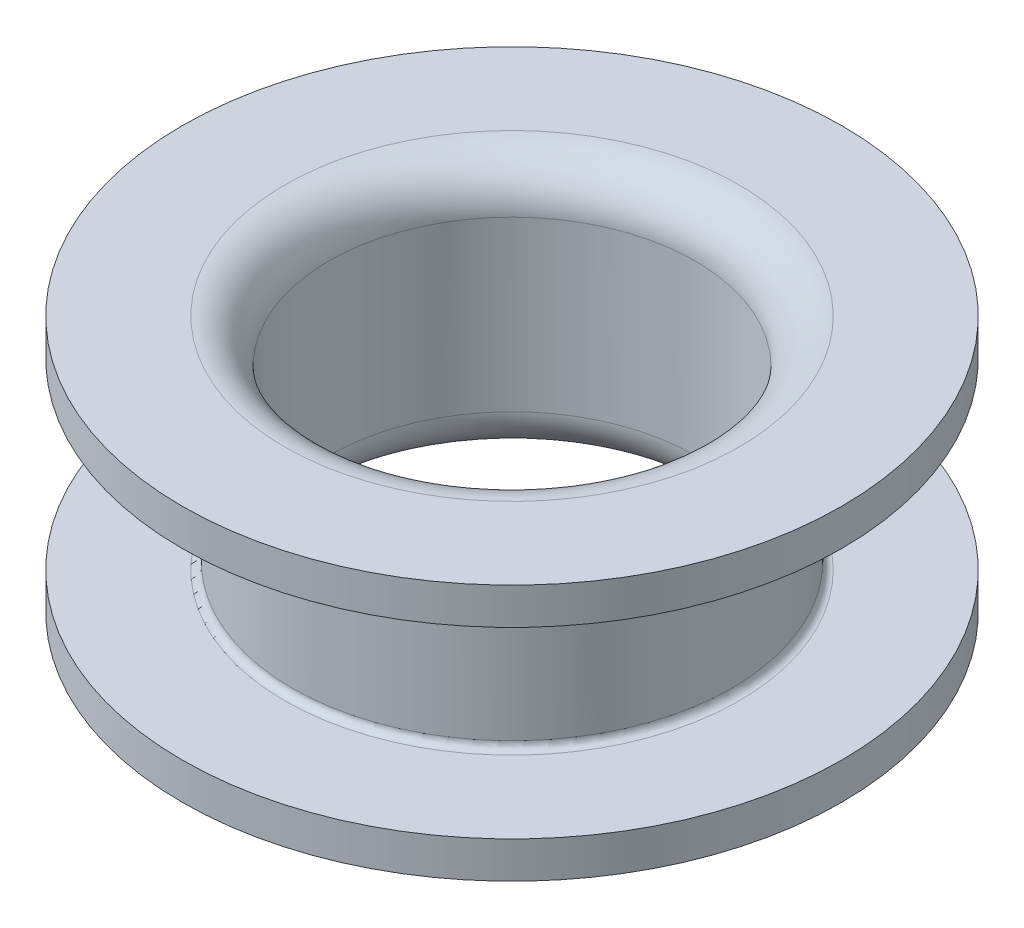
ISO-10303-21;
HEADER;
FILE_DESCRIPTION(('STEP AP214'),'2;1');
FILE_NAME('part.step','',(''),(''),'','','');
FILE_SCHEMA(('AUTOMOTIVE_DESIGN { 1 0 10303 214 1 1 1 1 }'));
ENDSEC;
DATA;
#1=APPLICATION_CONTEXT('core data for automotive mechanical design processes');
#2=APPLICATION_PROTOCOL_DEFINITION('international standard','automotive_design',2000,#1);
#3=PRODUCT_CONTEXT('',#1,'mechanical');
#4=PRODUCT('Part','Part','',(#3));
#5=PRODUCT_RELATED_PRODUCT_CATEGORY('part','',(#4));
#6=PRODUCT_DEFINITION_FORMATION('','',#4);
#7=PRODUCT_DEFINITION_CONTEXT('part definition',#1,'design');
#8=PRODUCT_DEFINITION('design','',#6,#7);
#9=PRODUCT_DEFINITION_SHAPE('','',#8);
#10=(LENGTH_UNIT() NAMED_UNIT(*) SI_UNIT(.MILLI.,.METRE.));
#11=(NAMED_UNIT(*) PLANE_ANGLE_UNIT() SI_UNIT($,.RADIAN.));
#12=(NAMED_UNIT(*) SI_UNIT($,.STERADIAN.) SOLID_ANGLE_UNIT());
#13=UNCERTAINTY_MEASURE_WITH_UNIT(LENGTH_MEASURE(1.E-05),#10,'distance_accuracy_value','');
#14=(GEOMETRIC_REPRESENTATION_CONTEXT(3) GLOBAL_UNCERTAINTY_ASSIGNED_CONTEXT((#13)) GLOBAL_UNIT_ASSIGNED_CONTEXT((#10,
#11,#12)) REPRESENTATION_CONTEXT('',''));
#15=CARTESIAN_POINT('',(0.,0.,0.));
#16=DIRECTION('',(0.,0.,1.));
#17=DIRECTION('',(1.,0.,0.));
#18=AXIS2_PLACEMENT_3D('',#15,#16,#17);
#19=CARTESIAN_POINT('',(2160.44964706,605.52533354,716.131939028996));
#20=DIRECTION('',(0.,-1.,0.));
#21=DIRECTION('',(0.,0.,-1.));
#22=AXIS2_PLACEMENT_3D('',#19,#20,#21);
#23=CYLINDRICAL_SURFACE('',#22,8.9999999999999);
#24=CARTESIAN_POINT('',(2160.44964706,605.52533354,716.131939028996));
#25=DIRECTION('',(0.,-1.,0.));
#26=DIRECTION('',(0.,0.,-1.));
#27=AXIS2_PLACEMENT_3D('',#24,#25,#26);
#28=CIRCLE('',#27,8.9999999999999);
#29=CARTESIAN_POINT('',(2160.44964706,605.52533354,707.131939028996));
#30=VERTEX_POINT('',#29);
#31=EDGE_CURVE('E64',#30,#30,#28,.T.);
#32=ORIENTED_EDGE('',*,*,#31,.T.);
#33=EDGE_LOOP('',(#32));
#34=FACE_BOUND('',#33,.T.);
#35=CARTESIAN_POINT('',(2160.44964706,604.52533354,716.131939028996));
#36=DIRECTION('',(0.,-1.,0.));
#37=DIRECTION('',(0.,0.,-1.));
#38=AXIS2_PLACEMENT_3D('',#35,#36,#37);
#39=CIRCLE('',#38,8.9999999999999);
#40=CARTESIAN_POINT('',(2160.44964706,604.52533354,707.131939028996));
#41=VERTEX_POINT('',#40);
#42=EDGE_CURVE('E73',#41,#41,#39,.T.);
#43=ORIENTED_EDGE('',*,*,#42,.F.);
#44=EDGE_LOOP('',(#43));
#45=FACE_BOUND('',#44,.T.);
#46=ADVANCED_FACE('F33',(#34,#45),#23,.T.);
#47=CARTESIAN_POINT('',(2169.44964706,605.52533354,716.131939028996));
#48=DIRECTION('',(0.,1.,0.));
#49=DIRECTION('',(0.,0.,1.));
#50=AXIS2_PLACEMENT_3D('',#47,#48,#49);
#51=PLANE('',#50);
#52=CARTESIAN_POINT('',(2160.44964706,605.52533354,716.131939028996));
#53=DIRECTION('',(0.,1.,0.));
#54=DIRECTION('',(0.,0.,1.));
#55=AXIS2_PLACEMENT_3D('',#52,#53,#54);
#56=CIRCLE('',#55,6.19999999999989);
#57=CARTESIAN_POINT('',(2160.44964706,605.52533354,722.331939028996));
#58=VERTEX_POINT('',#57);
#59=EDGE_CURVE('E10',#58,#58,#56,.F.);
#60=ORIENTED_EDGE('',*,*,#59,.T.);
#61=EDGE_LOOP('',(#60));
#62=FACE_BOUND('',#61,.T.);
#63=ORIENTED_EDGE('',*,*,#31,.F.);
#64=EDGE_LOOP('',(#63));
#65=FACE_BOUND('',#64,.T.);
#66=ADVANCED_FACE('F80',(#62,#65),#51,.T.);
#67=CARTESIAN_POINT('',(2160.44964706,598.52533354,716.131939028996));
#68=DIRECTION('',(0.,-1.,0.));
#69=DIRECTION('',(0.,0.,-1.));
#70=AXIS2_PLACEMENT_3D('',#67,#68,#69);
#71=PLANE('',#70);
#72=CARTESIAN_POINT('',(2160.44964706,598.52533354,716.131939028996));
#73=DIRECTION('',(0.,-1.,0.));
#74=DIRECTION('',(0.,0.,-1.));
#75=AXIS2_PLACEMENT_3D('',#72,#73,#74);
#76=CIRCLE('',#75,6.19999999999989);
#77=CARTESIAN_POINT('',(2160.44964706,598.52533354,709.931939028996));
#78=VERTEX_POINT('',#77);
#79=EDGE_CURVE('E47',#78,#78,#76,.F.);
#80=ORIENTED_EDGE('',*,*,#79,.T.);
#81=EDGE_LOOP('',(#80));
#82=FACE_BOUND('',#81,.T.);
#83=CARTESIAN_POINT('',(2160.44964706,598.52533354,716.131939028996));
#84=DIRECTION('',(0.,-1.,0.));
#85=DIRECTION('',(0.,0.,-1.));
#86=AXIS2_PLACEMENT_3D('',#83,#84,#85);
#87=CIRCLE('',#86,8.9999999999999);
#88=CARTESIAN_POINT('',(2160.44964706,598.52533354,707.131939028996));
#89=VERTEX_POINT('',#88);
#90=EDGE_CURVE('E67',#89,#89,#87,.T.);
#91=ORIENTED_EDGE('',*,*,#90,.T.);
#92=EDGE_LOOP('',(#91));
#93=FACE_BOUND('',#92,.T.);
#94=ADVANCED_FACE('F85',(#82,#93),#71,.T.);
#95=CARTESIAN_POINT('',(2160.44964706,605.52533354,716.131939028996));
#96=DIRECTION('',(0.,-1.,0.));
#97=DIRECTION('',(0.,0.,-1.));
#98=AXIS2_PLACEMENT_3D('',#95,#96,#97);
#99=CYLINDRICAL_SURFACE('',#98,8.9999999999999);
#100=CARTESIAN_POINT('',(2160.44964706,599.525333539999,716.131939028996));
#101=DIRECTION('',(0.,-1.,0.));
#102=DIRECTION('',(0.,0.,-1.));
#103=AXIS2_PLACEMENT_3D('',#100,#101,#102);
#104=CIRCLE('',#103,8.9999999999999);
#105=CARTESIAN_POINT('',(2160.44964706,599.525333539999,707.131939028996));
#106=VERTEX_POINT('',#105);
#107=EDGE_CURVE('E70',#106,#106,#104,.T.);
#108=ORIENTED_EDGE('',*,*,#107,.T.);
#109=EDGE_LOOP('',(#108));
#110=FACE_BOUND('',#109,.T.);
#111=ORIENTED_EDGE('',*,*,#90,.F.);
#112=EDGE_LOOP('',(#111));
#113=FACE_BOUND('',#112,.T.);
#114=ADVANCED_FACE('F91',(#110,#113),#99,.T.);
#115=CARTESIAN_POINT('',(2169.44964706,599.525333539999,716.131939028996));
#116=DIRECTION('',(0.,1.,0.));
#117=DIRECTION('',(0.,0.,1.));
#118=AXIS2_PLACEMENT_3D('',#115,#116,#117);
#119=PLANE('',#118);
#120=CARTESIAN_POINT('',(2160.44964706,599.525333539999,716.131939028996));
#121=DIRECTION('',(0.,1.,0.));
#122=DIRECTION('',(0.,0.,1.));
#123=AXIS2_PLACEMENT_3D('',#120,#121,#122);
#124=CIRCLE('',#123,6.19999999999978);
#125=CARTESIAN_POINT('',(2160.44964706,599.525333539999,722.331939028996));
#126=VERTEX_POINT('',#125);
#127=EDGE_CURVE('E61',#126,#126,#124,.F.);
#128=ORIENTED_EDGE('',*,*,#127,.T.);
#129=EDGE_LOOP('',(#128));
#130=FACE_BOUND('',#129,.T.);
#131=ORIENTED_EDGE('',*,*,#107,.F.);
#132=EDGE_LOOP('',(#131));
#133=FACE_BOUND('',#132,.T.);
#134=ADVANCED_FACE('F97',(#130,#133),#119,.T.);
#135=CARTESIAN_POINT('',(2160.44964706,605.52533354,716.131939028996));
#136=DIRECTION('',(0.,-1.,0.));
#137=DIRECTION('',(0.,0.,-1.));
#138=AXIS2_PLACEMENT_3D('',#135,#136,#137);
#139=CYLINDRICAL_SURFACE('',#138,5.99999999999978);
#140=CARTESIAN_POINT('',(2160.44964706,599.725333539999,716.131939028996));
#141=DIRECTION('',(0.,1.,0.));
#142=DIRECTION('',(0.,0.,1.));
#143=AXIS2_PLACEMENT_3D('',#140,#141,#142);
#144=CIRCLE('',#143,5.99999999999978);
#145=CARTESIAN_POINT('',(2160.44964706,599.725333539999,722.131939028996));
#146=VERTEX_POINT('',#145);
#147=EDGE_CURVE('E55',#146,#146,#144,.T.);
#148=ORIENTED_EDGE('',*,*,#147,.T.);
#149=EDGE_LOOP('',(#148));
#150=FACE_BOUND('',#149,.T.);
#151=CARTESIAN_POINT('',(2160.44964706,604.32533354,716.131939028996));
#152=DIRECTION('',(0.,-1.,0.));
#153=DIRECTION('',(0.,0.,-1.));
#154=AXIS2_PLACEMENT_3D('',#151,#152,#153);
#155=CIRCLE('',#154,5.99999999999978);
#156=CARTESIAN_POINT('',(2160.44964706,604.32533354,710.131939028997));
#157=VERTEX_POINT('',#156);
#158=EDGE_CURVE('E58',#157,#157,#155,.T.);
#159=ORIENTED_EDGE('',*,*,#158,.T.);
#160=EDGE_LOOP('',(#159));
#161=FACE_BOUND('',#160,.T.);
#162=ADVANCED_FACE('F101',(#150,#161),#139,.T.);
#163=CARTESIAN_POINT('',(2166.44964706,604.52533354,716.131939028996));
#164=DIRECTION('',(0.,-1.,0.));
#165=DIRECTION('',(0.,0.,-1.));
#166=AXIS2_PLACEMENT_3D('',#163,#164,#165);
#167=PLANE('',#166);
#168=CARTESIAN_POINT('',(2160.44964706,604.52533354,716.131939028996));
#169=DIRECTION('',(0.,-1.,0.));
#170=DIRECTION('',(0.,0.,-1.));
#171=AXIS2_PLACEMENT_3D('',#168,#169,#170);
#172=CIRCLE('',#171,6.19999999999978);
#173=CARTESIAN_POINT('',(2160.44964706,604.52533354,709.931939028997));
#174=VERTEX_POINT('',#173);
#175=EDGE_CURVE('E52',#174,#174,#172,.F.);
#176=ORIENTED_EDGE('',*,*,#175,.T.);
#177=EDGE_LOOP('',(#176));
#178=FACE_BOUND('',#177,.T.);
#179=ORIENTED_EDGE('',*,*,#42,.T.);
#180=EDGE_LOOP('',(#179));
#181=FACE_BOUND('',#180,.T.);
#182=ADVANCED_FACE('F77',(#178,#181),#167,.T.);
#183=CARTESIAN_POINT('',(2160.44964706,598.525332764001,716.131939028996));
#184=DIRECTION('',(0.,1.,0.));
#185=DIRECTION('',(0.,0.,1.));
#186=AXIS2_PLACEMENT_3D('',#183,#184,#185);
#187=CYLINDRICAL_SURFACE('',#186,4.99999999999989);
#188=CARTESIAN_POINT('',(2160.44964706,599.72533354,716.131939028996));
#189=DIRECTION('',(0.,-1.,0.));
#190=DIRECTION('',(0.,0.,-1.));
#191=AXIS2_PLACEMENT_3D('',#188,#189,#190);
#192=CIRCLE('',#191,4.99999999999989);
#193=CARTESIAN_POINT('',(2160.44964706,599.72533354,711.131939028996));
#194=VERTEX_POINT('',#193);
#195=EDGE_CURVE('E39',#194,#194,#192,.T.);
#196=ORIENTED_EDGE('',*,*,#195,.T.);
#197=EDGE_LOOP('',(#196));
#198=FACE_BOUND('',#197,.T.);
#199=CARTESIAN_POINT('',(2160.44964706,604.32533354,716.131939028996));
#200=DIRECTION('',(0.,1.,0.));
#201=DIRECTION('',(0.,0.,1.));
#202=AXIS2_PLACEMENT_3D('',#199,#200,#201);
#203=CIRCLE('',#202,4.99999999999989);
#204=CARTESIAN_POINT('',(2160.44964706,604.32533354,721.131939028996));
#205=VERTEX_POINT('',#204);
#206=EDGE_CURVE('E43',#205,#205,#203,.T.);
#207=ORIENTED_EDGE('',*,*,#206,.T.);
#208=EDGE_LOOP('',(#207));
#209=FACE_BOUND('',#208,.T.);
#210=ADVANCED_FACE('F108',(#198,#209),#187,.F.);
#211=CARTESIAN_POINT('',(2160.44964706,599.725333539999,716.131939028996));
#212=DIRECTION('',(0.,1.,0.));
#213=DIRECTION('',(0.,0.,1.));
#214=AXIS2_PLACEMENT_3D('',#211,#212,#213);
#215=TOROIDAL_SURFACE('',#214,6.19999999999978,0.2);
#216=ORIENTED_EDGE('',*,*,#147,.F.);
#217=EDGE_LOOP('',(#216));
#218=FACE_BOUND('',#217,.T.);
#219=ORIENTED_EDGE('',*,*,#127,.F.);
#220=EDGE_LOOP('',(#219));
#221=FACE_BOUND('',#220,.T.);
#222=ADVANCED_FACE('F112',(#218,#221),#215,.F.);
#223=CARTESIAN_POINT('',(2160.44964706,604.32533354,716.131939028996));
#224=DIRECTION('',(0.,-1.,0.));
#225=DIRECTION('',(0.,0.,-1.));
#226=AXIS2_PLACEMENT_3D('',#223,#224,#225);
#227=TOROIDAL_SURFACE('',#226,6.19999999999978,0.2);
#228=ORIENTED_EDGE('',*,*,#175,.F.);
#229=EDGE_LOOP('',(#228));
#230=FACE_BOUND('',#229,.T.);
#231=ORIENTED_EDGE('',*,*,#158,.F.);
#232=EDGE_LOOP('',(#231));
#233=FACE_BOUND('',#232,.T.);
#234=ADVANCED_FACE('F115',(#230,#233),#227,.F.);
#235=CARTESIAN_POINT('',(2160.44964706,599.72533354,716.131939028996));
#236=DIRECTION('',(0.,-1.,0.));
#237=DIRECTION('',(0.,0.,-1.));
#238=AXIS2_PLACEMENT_3D('',#235,#236,#237);
#239=TOROIDAL_SURFACE('',#238,6.19999999999989,1.2);
#240=ORIENTED_EDGE('',*,*,#195,.F.);
#241=EDGE_LOOP('',(#240));
#242=FACE_BOUND('',#241,.T.);
#243=ORIENTED_EDGE('',*,*,#79,.F.);
#244=EDGE_LOOP('',(#243));
#245=FACE_BOUND('',#244,.T.);
#246=ADVANCED_FACE('F119',(#242,#245),#239,.T.);
#247=CARTESIAN_POINT('',(2160.44964706,604.32533354,716.131939028996));
#248=DIRECTION('',(0.,1.,0.));
#249=DIRECTION('',(0.,0.,1.));
#250=AXIS2_PLACEMENT_3D('',#247,#248,#249);
#251=TOROIDAL_SURFACE('',#250,6.19999999999989,1.2);
#252=ORIENTED_EDGE('',*,*,#59,.F.);
#253=EDGE_LOOP('',(#252));
#254=FACE_BOUND('',#253,.T.);
#255=ORIENTED_EDGE('',*,*,#206,.F.);
#256=EDGE_LOOP('',(#255));
#257=FACE_BOUND('',#256,.T.);
#258=ADVANCED_FACE('F123',(#254,#257),#251,.T.);
#259=CLOSED_SHELL('',(#46,#66,#94,#114,#134,#162,#182,#210,#222,#234,#246,#258));
#260=MANIFOLD_SOLID_BREP('B2',#259);
#261=ADVANCED_BREP_SHAPE_REPRESENTATION('',(#18,#260),#14);
#262=SHAPE_DEFINITION_REPRESENTATION(#9,#261);
ENDSEC;
END-ISO-10303-21;
